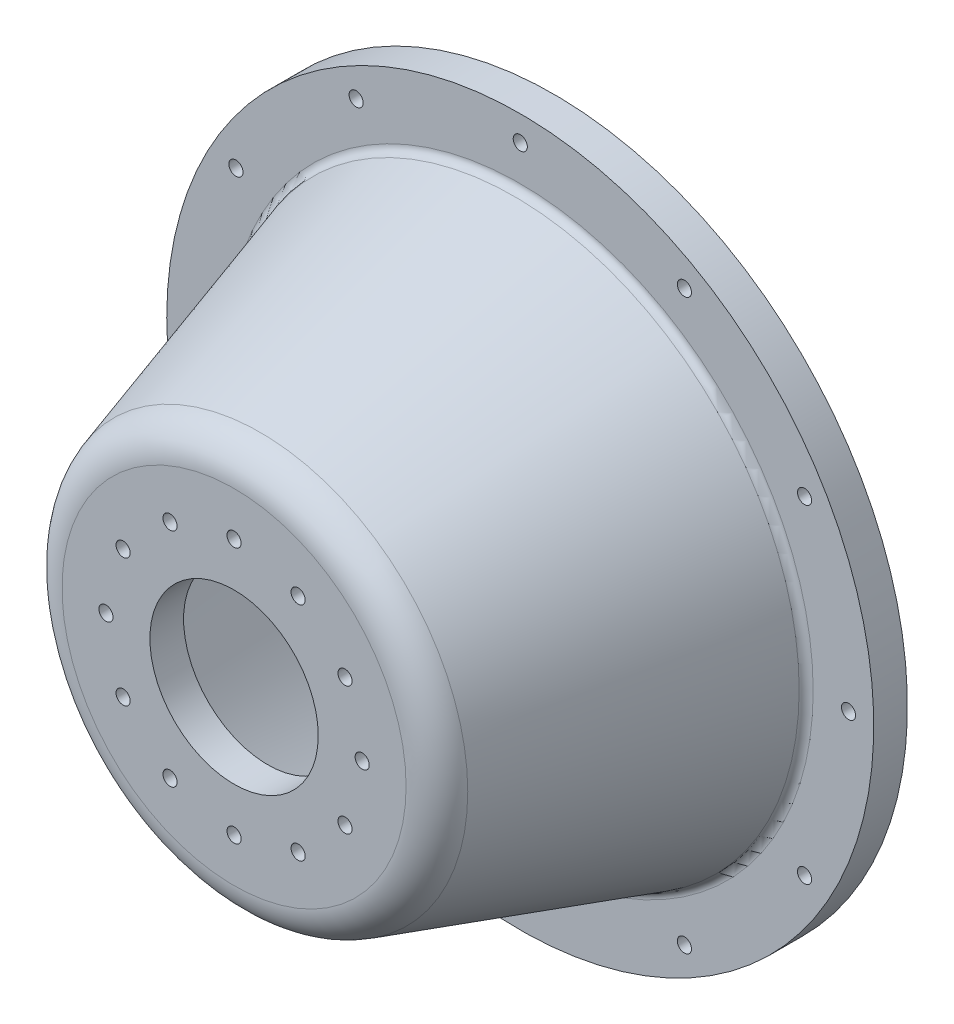
ISO-10303-21;
HEADER;
FILE_DESCRIPTION(('STEP AP214'),'2;1');
FILE_NAME('part.step','',(''),(''),'','','');
FILE_SCHEMA(('AUTOMOTIVE_DESIGN { 1 0 10303 214 1 1 1 1 }'));
ENDSEC;
DATA;
#1=APPLICATION_CONTEXT('core data for automotive mechanical design processes');
#2=APPLICATION_PROTOCOL_DEFINITION('international standard','automotive_design',2000,#1);
#3=PRODUCT_CONTEXT('',#1,'mechanical');
#4=PRODUCT('Part','Part','',(#3));
#5=PRODUCT_RELATED_PRODUCT_CATEGORY('part','',(#4));
#6=PRODUCT_DEFINITION_FORMATION('','',#4);
#7=PRODUCT_DEFINITION_CONTEXT('part definition',#1,'design');
#8=PRODUCT_DEFINITION('design','',#6,#7);
#9=PRODUCT_DEFINITION_SHAPE('','',#8);
#10=(LENGTH_UNIT() NAMED_UNIT(*) SI_UNIT(.MILLI.,.METRE.));
#11=(NAMED_UNIT(*) PLANE_ANGLE_UNIT() SI_UNIT($,.RADIAN.));
#12=(NAMED_UNIT(*) SI_UNIT($,.STERADIAN.) SOLID_ANGLE_UNIT());
#13=UNCERTAINTY_MEASURE_WITH_UNIT(LENGTH_MEASURE(1.E-05),#10,'distance_accuracy_value','');
#14=(GEOMETRIC_REPRESENTATION_CONTEXT(3) GLOBAL_UNCERTAINTY_ASSIGNED_CONTEXT((#13)) GLOBAL_UNIT_ASSIGNED_CONTEXT((#10,
#11,#12)) REPRESENTATION_CONTEXT('',''));
#15=CARTESIAN_POINT('',(0.,0.,0.));
#16=DIRECTION('',(0.,0.,1.));
#17=DIRECTION('',(1.,0.,0.));
#18=AXIS2_PLACEMENT_3D('',#15,#16,#17);
#19=CARTESIAN_POINT('',(50.,0.,170.));
#20=DIRECTION('',(0.,0.,1.));
#21=DIRECTION('',(1.,0.,0.));
#22=AXIS2_PLACEMENT_3D('',#19,#20,#21);
#23=PLANE('',#22);
#24=CARTESIAN_POINT('',(0.,0.,170.));
#25=DIRECTION('',(0.,0.,1.));
#26=DIRECTION('',(1.,0.,0.));
#27=AXIS2_PLACEMENT_3D('',#24,#25,#26);
#28=CIRCLE('',#27,102.190476190476);
#29=CARTESIAN_POINT('',(102.190476190476,0.,170.));
#30=VERTEX_POINT('',#29);
#31=EDGE_CURVE('E67',#30,#30,#28,.F.);
#32=ORIENTED_EDGE('',*,*,#31,.T.);
#33=EDGE_LOOP('',(#32));
#34=FACE_BOUND('',#33,.T.);
#35=CARTESIAN_POINT('',(0.,76.0952380952381,170.));
#36=DIRECTION('',(0.,0.,-1.));
#37=DIRECTION('',(-1.,0.,0.));
#38=AXIS2_PLACEMENT_3D('',#35,#36,#37);
#39=CIRCLE('',#38,4.19999999999999);
#40=CARTESIAN_POINT('',(-4.19999999999999,76.0952380952381,170.));
#41=VERTEX_POINT('',#40);
#42=EDGE_CURVE('E226',#41,#41,#39,.T.);
#43=ORIENTED_EDGE('',*,*,#42,.F.);
#44=EDGE_LOOP('',(#43));
#45=FACE_BOUND('',#44,.T.);
#46=CARTESIAN_POINT('',(-38.047619047619,65.9004092975016,170.));
#47=DIRECTION('',(0.,0.,-1.));
#48=DIRECTION('',(-1.,0.,0.));
#49=AXIS2_PLACEMENT_3D('',#46,#47,#48);
#50=CIRCLE('',#49,4.19999999999999);
#51=CARTESIAN_POINT('',(-42.247619047619,65.9004092975016,170.));
#52=VERTEX_POINT('',#51);
#53=EDGE_CURVE('E220',#52,#52,#50,.T.);
#54=ORIENTED_EDGE('',*,*,#53,.F.);
#55=EDGE_LOOP('',(#54));
#56=FACE_BOUND('',#55,.T.);
#57=CARTESIAN_POINT('',(-65.9004092975016,38.047619047619,170.));
#58=DIRECTION('',(0.,0.,-1.));
#59=DIRECTION('',(-1.,0.,0.));
#60=AXIS2_PLACEMENT_3D('',#57,#58,#59);
#61=CIRCLE('',#60,4.19999999999999);
#62=CARTESIAN_POINT('',(-70.1004092975016,38.047619047619,170.));
#63=VERTEX_POINT('',#62);
#64=EDGE_CURVE('E214',#63,#63,#61,.T.);
#65=ORIENTED_EDGE('',*,*,#64,.F.);
#66=EDGE_LOOP('',(#65));
#67=FACE_BOUND('',#66,.T.);
#68=CARTESIAN_POINT('',(-76.0952380952381,0.,170.));
#69=DIRECTION('',(0.,0.,-1.));
#70=DIRECTION('',(-1.,0.,0.));
#71=AXIS2_PLACEMENT_3D('',#68,#69,#70);
#72=CIRCLE('',#71,4.2);
#73=CARTESIAN_POINT('',(-80.2952380952381,0.,170.));
#74=VERTEX_POINT('',#73);
#75=EDGE_CURVE('E208',#74,#74,#72,.T.);
#76=ORIENTED_EDGE('',*,*,#75,.F.);
#77=EDGE_LOOP('',(#76));
#78=FACE_BOUND('',#77,.T.);
#79=CARTESIAN_POINT('',(-65.9004092975016,-38.047619047619,170.));
#80=DIRECTION('',(0.,0.,-1.));
#81=DIRECTION('',(-1.,0.,0.));
#82=AXIS2_PLACEMENT_3D('',#79,#80,#81);
#83=CIRCLE('',#82,4.19999999999999);
#84=CARTESIAN_POINT('',(-70.1004092975016,-38.047619047619,170.));
#85=VERTEX_POINT('',#84);
#86=EDGE_CURVE('E202',#85,#85,#83,.T.);
#87=ORIENTED_EDGE('',*,*,#86,.F.);
#88=EDGE_LOOP('',(#87));
#89=FACE_BOUND('',#88,.T.);
#90=CARTESIAN_POINT('',(-38.0476190476191,-65.9004092975016,170.));
#91=DIRECTION('',(0.,0.,-1.));
#92=DIRECTION('',(-1.,0.,0.));
#93=AXIS2_PLACEMENT_3D('',#90,#91,#92);
#94=CIRCLE('',#93,4.19999999999999);
#95=CARTESIAN_POINT('',(-42.2476190476191,-65.9004092975016,170.));
#96=VERTEX_POINT('',#95);
#97=EDGE_CURVE('E196',#96,#96,#94,.T.);
#98=ORIENTED_EDGE('',*,*,#97,.F.);
#99=EDGE_LOOP('',(#98));
#100=FACE_BOUND('',#99,.T.);
#101=CARTESIAN_POINT('',(0.,-76.0952380952381,170.));
#102=DIRECTION('',(0.,0.,-1.));
#103=DIRECTION('',(-1.,0.,0.));
#104=AXIS2_PLACEMENT_3D('',#101,#102,#103);
#105=CIRCLE('',#104,4.19999999999999);
#106=CARTESIAN_POINT('',(-4.20000000000005,-76.0952380952381,170.));
#107=VERTEX_POINT('',#106);
#108=EDGE_CURVE('E190',#107,#107,#105,.T.);
#109=ORIENTED_EDGE('',*,*,#108,.F.);
#110=EDGE_LOOP('',(#109));
#111=FACE_BOUND('',#110,.T.);
#112=CARTESIAN_POINT('',(38.047619047619,-65.9004092975016,170.));
#113=DIRECTION('',(0.,0.,-1.));
#114=DIRECTION('',(-1.,0.,0.));
#115=AXIS2_PLACEMENT_3D('',#112,#113,#114);
#116=CIRCLE('',#115,4.19999999999999);
#117=CARTESIAN_POINT('',(33.847619047619,-65.9004092975016,170.));
#118=VERTEX_POINT('',#117);
#119=EDGE_CURVE('E184',#118,#118,#116,.T.);
#120=ORIENTED_EDGE('',*,*,#119,.F.);
#121=EDGE_LOOP('',(#120));
#122=FACE_BOUND('',#121,.T.);
#123=CARTESIAN_POINT('',(65.9004092975015,-38.0476190476192,170.));
#124=DIRECTION('',(0.,0.,-1.));
#125=DIRECTION('',(-1.,0.,0.));
#126=AXIS2_PLACEMENT_3D('',#123,#124,#125);
#127=CIRCLE('',#126,4.2);
#128=CARTESIAN_POINT('',(61.7004092975015,-38.0476190476192,170.));
#129=VERTEX_POINT('',#128);
#130=EDGE_CURVE('E178',#129,#129,#127,.T.);
#131=ORIENTED_EDGE('',*,*,#130,.F.);
#132=EDGE_LOOP('',(#131));
#133=FACE_BOUND('',#132,.T.);
#134=CARTESIAN_POINT('',(76.0952380952381,0.,170.));
#135=DIRECTION('',(0.,0.,-1.));
#136=DIRECTION('',(-1.,0.,0.));
#137=AXIS2_PLACEMENT_3D('',#134,#135,#136);
#138=CIRCLE('',#137,4.2);
#139=CARTESIAN_POINT('',(71.8952380952381,0.,170.));
#140=VERTEX_POINT('',#139);
#141=EDGE_CURVE('E172',#140,#140,#138,.T.);
#142=ORIENTED_EDGE('',*,*,#141,.F.);
#143=EDGE_LOOP('',(#142));
#144=FACE_BOUND('',#143,.T.);
#145=CARTESIAN_POINT('',(65.9004092975016,38.047619047619,170.));
#146=DIRECTION('',(0.,0.,-1.));
#147=DIRECTION('',(-1.,0.,0.));
#148=AXIS2_PLACEMENT_3D('',#145,#146,#147);
#149=CIRCLE('',#148,4.19999999999998);
#150=CARTESIAN_POINT('',(61.7004092975016,38.047619047619,170.));
#151=VERTEX_POINT('',#150);
#152=EDGE_CURVE('E166',#151,#151,#149,.T.);
#153=ORIENTED_EDGE('',*,*,#152,.F.);
#154=EDGE_LOOP('',(#153));
#155=FACE_BOUND('',#154,.T.);
#156=CARTESIAN_POINT('',(0.,0.,170.));
#157=DIRECTION('',(0.,0.,1.));
#158=DIRECTION('',(1.,0.,0.));
#159=AXIS2_PLACEMENT_3D('',#156,#157,#158);
#160=CIRCLE('',#159,50.);
#161=CARTESIAN_POINT('',(50.,0.,170.));
#162=VERTEX_POINT('',#161);
#163=EDGE_CURVE('E82',#162,#162,#160,.T.);
#164=ORIENTED_EDGE('',*,*,#163,.T.);
#165=EDGE_LOOP('',(#164));
#166=FACE_BOUND('',#165,.T.);
#167=CARTESIAN_POINT('',(38.0476190476192,65.9004092975015,170.));
#168=DIRECTION('',(0.,0.,-1.));
#169=DIRECTION('',(-1.,0.,0.));
#170=AXIS2_PLACEMENT_3D('',#167,#168,#169);
#171=CIRCLE('',#170,4.19999999999999);
#172=CARTESIAN_POINT('',(33.8476190476192,65.9004092975015,170.));
#173=VERTEX_POINT('',#172);
#174=EDGE_CURVE('E160',#173,#173,#171,.T.);
#175=ORIENTED_EDGE('',*,*,#174,.F.);
#176=EDGE_LOOP('',(#175));
#177=FACE_BOUND('',#176,.T.);
#178=ADVANCED_FACE('F41',(#34,#45,#56,#67,#78,#89,#100,#111,#122,#133,#144,#155,#166,#177),#23,.F.);
#179=CARTESIAN_POINT('',(0.,0.,20.));
#180=DIRECTION('',(0.,0.,-1.));
#181=DIRECTION('',(-1.,0.,0.));
#182=AXIS2_PLACEMENT_3D('',#179,#180,#181);
#183=CYLINDRICAL_SURFACE('',#182,210.);
#184=CARTESIAN_POINT('',(0.,0.,20.));
#185=DIRECTION('',(0.,0.,-1.));
#186=DIRECTION('',(-1.,0.,0.));
#187=AXIS2_PLACEMENT_3D('',#184,#185,#186);
#188=CIRCLE('',#187,210.);
#189=CARTESIAN_POINT('',(-210.,0.,20.));
#190=VERTEX_POINT('',#189);
#191=EDGE_CURVE('E73',#190,#190,#188,.T.);
#192=ORIENTED_EDGE('',*,*,#191,.T.);
#193=EDGE_LOOP('',(#192));
#194=FACE_BOUND('',#193,.T.);
#195=CARTESIAN_POINT('',(0.,0.,0.));
#196=DIRECTION('',(0.,0.,-1.));
#197=DIRECTION('',(-1.,0.,0.));
#198=AXIS2_PLACEMENT_3D('',#195,#196,#197);
#199=CIRCLE('',#198,210.);
#200=CARTESIAN_POINT('',(-210.,0.,0.));
#201=VERTEX_POINT('',#200);
#202=EDGE_CURVE('E76',#201,#201,#199,.T.);
#203=ORIENTED_EDGE('',*,*,#202,.F.);
#204=EDGE_LOOP('',(#203));
#205=FACE_BOUND('',#204,.T.);
#206=ADVANCED_FACE('F234',(#194,#205),#183,.T.);
#207=CARTESIAN_POINT('',(210.,0.,20.));
#208=DIRECTION('',(0.,0.,1.));
#209=DIRECTION('',(1.,0.,0.));
#210=AXIS2_PLACEMENT_3D('',#207,#208,#209);
#211=PLANE('',#210);
#212=CARTESIAN_POINT('',(0.,0.,20.));
#213=DIRECTION('',(0.,0.,1.));
#214=DIRECTION('',(1.,0.,0.));
#215=AXIS2_PLACEMENT_3D('',#212,#213,#214);
#216=CIRCLE('',#215,174.);
#217=CARTESIAN_POINT('',(174.,0.,20.));
#218=VERTEX_POINT('',#217);
#219=EDGE_CURVE('E61',#218,#218,#216,.F.);
#220=ORIENTED_EDGE('',*,*,#219,.T.);
#221=EDGE_LOOP('',(#220));
#222=FACE_BOUND('',#221,.T.);
#223=CARTESIAN_POINT('',(0.,195.,20.));
#224=DIRECTION('',(0.,0.,1.));
#225=DIRECTION('',(1.,0.,0.));
#226=AXIS2_PLACEMENT_3D('',#223,#224,#225);
#227=CIRCLE('',#226,4.19999999999999);
#228=CARTESIAN_POINT('',(4.19999999999999,195.,20.));
#229=VERTEX_POINT('',#228);
#230=EDGE_CURVE('E154',#229,#229,#227,.T.);
#231=ORIENTED_EDGE('',*,*,#230,.F.);
#232=EDGE_LOOP('',(#231));
#233=FACE_BOUND('',#232,.T.);
#234=CARTESIAN_POINT('',(97.5,168.874953737965,20.));
#235=DIRECTION('',(0.,0.,1.));
#236=DIRECTION('',(1.,0.,0.));
#237=AXIS2_PLACEMENT_3D('',#234,#235,#236);
#238=CIRCLE('',#237,4.19999999999998);
#239=CARTESIAN_POINT('',(101.7,168.874953737965,20.));
#240=VERTEX_POINT('',#239);
#241=EDGE_CURVE('E148',#240,#240,#238,.T.);
#242=ORIENTED_EDGE('',*,*,#241,.F.);
#243=EDGE_LOOP('',(#242));
#244=FACE_BOUND('',#243,.T.);
#245=CARTESIAN_POINT('',(168.874953737965,97.5,20.));
#246=DIRECTION('',(0.,0.,1.));
#247=DIRECTION('',(1.,0.,0.));
#248=AXIS2_PLACEMENT_3D('',#245,#246,#247);
#249=CIRCLE('',#248,4.19999999999998);
#250=CARTESIAN_POINT('',(173.074953737965,97.5,20.));
#251=VERTEX_POINT('',#250);
#252=EDGE_CURVE('E142',#251,#251,#249,.T.);
#253=ORIENTED_EDGE('',*,*,#252,.F.);
#254=EDGE_LOOP('',(#253));
#255=FACE_BOUND('',#254,.T.);
#256=CARTESIAN_POINT('',(195.,0.,20.));
#257=DIRECTION('',(0.,0.,1.));
#258=DIRECTION('',(1.,0.,0.));
#259=AXIS2_PLACEMENT_3D('',#256,#257,#258);
#260=CIRCLE('',#259,4.19999999999998);
#261=CARTESIAN_POINT('',(199.2,0.,20.));
#262=VERTEX_POINT('',#261);
#263=EDGE_CURVE('E136',#262,#262,#260,.T.);
#264=ORIENTED_EDGE('',*,*,#263,.F.);
#265=EDGE_LOOP('',(#264));
#266=FACE_BOUND('',#265,.T.);
#267=CARTESIAN_POINT('',(168.874953737965,-97.5,20.));
#268=DIRECTION('',(0.,0.,1.));
#269=DIRECTION('',(1.,0.,0.));
#270=AXIS2_PLACEMENT_3D('',#267,#268,#269);
#271=CIRCLE('',#270,4.19999999999998);
#272=CARTESIAN_POINT('',(173.074953737965,-97.5,20.));
#273=VERTEX_POINT('',#272);
#274=EDGE_CURVE('E130',#273,#273,#271,.T.);
#275=ORIENTED_EDGE('',*,*,#274,.F.);
#276=EDGE_LOOP('',(#275));
#277=FACE_BOUND('',#276,.T.);
#278=CARTESIAN_POINT('',(97.5,-168.874953737965,20.));
#279=DIRECTION('',(0.,0.,1.));
#280=DIRECTION('',(1.,0.,0.));
#281=AXIS2_PLACEMENT_3D('',#278,#279,#280);
#282=CIRCLE('',#281,4.19999999999998);
#283=CARTESIAN_POINT('',(101.7,-168.874953737965,20.));
#284=VERTEX_POINT('',#283);
#285=EDGE_CURVE('E124',#284,#284,#282,.T.);
#286=ORIENTED_EDGE('',*,*,#285,.F.);
#287=EDGE_LOOP('',(#286));
#288=FACE_BOUND('',#287,.T.);
#289=CARTESIAN_POINT('',(1.49314179258151E-13,-195.,20.));
#290=DIRECTION('',(0.,0.,1.));
#291=DIRECTION('',(1.,0.,0.));
#292=AXIS2_PLACEMENT_3D('',#289,#290,#291);
#293=CIRCLE('',#292,4.19999999999999);
#294=CARTESIAN_POINT('',(4.20000000000014,-195.,20.));
#295=VERTEX_POINT('',#294);
#296=EDGE_CURVE('E118',#295,#295,#293,.T.);
#297=ORIENTED_EDGE('',*,*,#296,.F.);
#298=EDGE_LOOP('',(#297));
#299=FACE_BOUND('',#298,.T.);
#300=CARTESIAN_POINT('',(-97.5,-168.874953737965,20.));
#301=DIRECTION('',(0.,0.,1.));
#302=DIRECTION('',(1.,0.,0.));
#303=AXIS2_PLACEMENT_3D('',#300,#301,#302);
#304=CIRCLE('',#303,4.19999999999998);
#305=CARTESIAN_POINT('',(-93.3,-168.874953737965,20.));
#306=VERTEX_POINT('',#305);
#307=EDGE_CURVE('E112',#306,#306,#304,.T.);
#308=ORIENTED_EDGE('',*,*,#307,.F.);
#309=EDGE_LOOP('',(#308));
#310=FACE_BOUND('',#309,.T.);
#311=CARTESIAN_POINT('',(-168.874953737965,-97.5,20.));
#312=DIRECTION('',(0.,0.,1.));
#313=DIRECTION('',(1.,0.,0.));
#314=AXIS2_PLACEMENT_3D('',#311,#312,#313);
#315=CIRCLE('',#314,4.19999999999998);
#316=CARTESIAN_POINT('',(-164.674953737965,-97.5,20.));
#317=VERTEX_POINT('',#316);
#318=EDGE_CURVE('E106',#317,#317,#315,.T.);
#319=ORIENTED_EDGE('',*,*,#318,.F.);
#320=EDGE_LOOP('',(#319));
#321=FACE_BOUND('',#320,.T.);
#322=CARTESIAN_POINT('',(-195.,-2.04553183510219E-13,20.));
#323=DIRECTION('',(0.,0.,1.));
#324=DIRECTION('',(1.,0.,0.));
#325=AXIS2_PLACEMENT_3D('',#322,#323,#324);
#326=CIRCLE('',#325,4.19999999999998);
#327=CARTESIAN_POINT('',(-190.8,-2.04553183510219E-13,20.));
#328=VERTEX_POINT('',#327);
#329=EDGE_CURVE('E100',#328,#328,#326,.T.);
#330=ORIENTED_EDGE('',*,*,#329,.F.);
#331=EDGE_LOOP('',(#330));
#332=FACE_BOUND('',#331,.T.);
#333=CARTESIAN_POINT('',(-168.874953737965,97.5,20.));
#334=DIRECTION('',(0.,0.,1.));
#335=DIRECTION('',(1.,0.,0.));
#336=AXIS2_PLACEMENT_3D('',#333,#334,#335);
#337=CIRCLE('',#336,4.19999999999998);
#338=CARTESIAN_POINT('',(-164.674953737965,97.5,20.));
#339=VERTEX_POINT('',#338);
#340=EDGE_CURVE('E94',#339,#339,#337,.T.);
#341=ORIENTED_EDGE('',*,*,#340,.F.);
#342=EDGE_LOOP('',(#341));
#343=FACE_BOUND('',#342,.T.);
#344=CARTESIAN_POINT('',(-97.5,168.874953737965,20.));
#345=DIRECTION('',(0.,0.,1.));
#346=DIRECTION('',(1.,0.,0.));
#347=AXIS2_PLACEMENT_3D('',#344,#345,#346);
#348=CIRCLE('',#347,4.19999999999998);
#349=CARTESIAN_POINT('',(-93.3,168.874953737965,20.));
#350=VERTEX_POINT('',#349);
#351=EDGE_CURVE('E88',#350,#350,#348,.T.);
#352=ORIENTED_EDGE('',*,*,#351,.F.);
#353=EDGE_LOOP('',(#352));
#354=FACE_BOUND('',#353,.T.);
#355=ORIENTED_EDGE('',*,*,#191,.F.);
#356=EDGE_LOOP('',(#355));
#357=FACE_BOUND('',#356,.T.);
#358=ADVANCED_FACE('F341',(#222,#233,#244,#255,#266,#277,#288,#299,#310,#321,#332,#343,#354,
#357),#211,.T.);
#359=CARTESIAN_POINT('',(0.,0.,0.));
#360=DIRECTION('',(0.,0.,-1.));
#361=DIRECTION('',(-1.,0.,0.));
#362=AXIS2_PLACEMENT_3D('',#359,#360,#361);
#363=PLANE('',#362);
#364=CARTESIAN_POINT('',(0.,0.,0.));
#365=DIRECTION('',(0.,0.,-1.));
#366=DIRECTION('',(-1.,0.,0.));
#367=AXIS2_PLACEMENT_3D('',#364,#365,#366);
#368=CIRCLE('',#367,174.);
#369=CARTESIAN_POINT('',(-174.,0.,0.));
#370=VERTEX_POINT('',#369);
#371=EDGE_CURVE('E48',#370,#370,#368,.F.);
#372=ORIENTED_EDGE('',*,*,#371,.T.);
#373=EDGE_LOOP('',(#372));
#374=FACE_BOUND('',#373,.T.);
#375=CARTESIAN_POINT('',(0.,195.,0.));
#376=DIRECTION('',(0.,0.,1.));
#377=DIRECTION('',(1.,0.,0.));
#378=AXIS2_PLACEMENT_3D('',#375,#376,#377);
#379=CIRCLE('',#378,4.19999999999999);
#380=CARTESIAN_POINT('',(4.19999999999999,195.,0.));
#381=VERTEX_POINT('',#380);
#382=EDGE_CURVE('E151',#381,#381,#379,.T.);
#383=ORIENTED_EDGE('',*,*,#382,.T.);
#384=EDGE_LOOP('',(#383));
#385=FACE_BOUND('',#384,.T.);
#386=CARTESIAN_POINT('',(97.5,168.874953737965,0.));
#387=DIRECTION('',(0.,0.,1.));
#388=DIRECTION('',(1.,0.,0.));
#389=AXIS2_PLACEMENT_3D('',#386,#387,#388);
#390=CIRCLE('',#389,4.19999999999998);
#391=CARTESIAN_POINT('',(101.7,168.874953737965,0.));
#392=VERTEX_POINT('',#391);
#393=EDGE_CURVE('E145',#392,#392,#390,.T.);
#394=ORIENTED_EDGE('',*,*,#393,.T.);
#395=EDGE_LOOP('',(#394));
#396=FACE_BOUND('',#395,.T.);
#397=CARTESIAN_POINT('',(168.874953737965,97.5,0.));
#398=DIRECTION('',(0.,0.,1.));
#399=DIRECTION('',(1.,0.,0.));
#400=AXIS2_PLACEMENT_3D('',#397,#398,#399);
#401=CIRCLE('',#400,4.19999999999998);
#402=CARTESIAN_POINT('',(173.074953737965,97.5,0.));
#403=VERTEX_POINT('',#402);
#404=EDGE_CURVE('E139',#403,#403,#401,.T.);
#405=ORIENTED_EDGE('',*,*,#404,.T.);
#406=EDGE_LOOP('',(#405));
#407=FACE_BOUND('',#406,.T.);
#408=CARTESIAN_POINT('',(195.,0.,0.));
#409=DIRECTION('',(0.,0.,1.));
#410=DIRECTION('',(1.,0.,0.));
#411=AXIS2_PLACEMENT_3D('',#408,#409,#410);
#412=CIRCLE('',#411,4.19999999999998);
#413=CARTESIAN_POINT('',(199.2,0.,0.));
#414=VERTEX_POINT('',#413);
#415=EDGE_CURVE('E133',#414,#414,#412,.T.);
#416=ORIENTED_EDGE('',*,*,#415,.T.);
#417=EDGE_LOOP('',(#416));
#418=FACE_BOUND('',#417,.T.);
#419=CARTESIAN_POINT('',(168.874953737965,-97.5,0.));
#420=DIRECTION('',(0.,0.,1.));
#421=DIRECTION('',(1.,0.,0.));
#422=AXIS2_PLACEMENT_3D('',#419,#420,#421);
#423=CIRCLE('',#422,4.19999999999998);
#424=CARTESIAN_POINT('',(173.074953737965,-97.5,0.));
#425=VERTEX_POINT('',#424);
#426=EDGE_CURVE('E127',#425,#425,#423,.T.);
#427=ORIENTED_EDGE('',*,*,#426,.T.);
#428=EDGE_LOOP('',(#427));
#429=FACE_BOUND('',#428,.T.);
#430=CARTESIAN_POINT('',(97.5,-168.874953737965,0.));
#431=DIRECTION('',(0.,0.,1.));
#432=DIRECTION('',(1.,0.,0.));
#433=AXIS2_PLACEMENT_3D('',#430,#431,#432);
#434=CIRCLE('',#433,4.19999999999998);
#435=CARTESIAN_POINT('',(101.7,-168.874953737965,0.));
#436=VERTEX_POINT('',#435);
#437=EDGE_CURVE('E121',#436,#436,#434,.T.);
#438=ORIENTED_EDGE('',*,*,#437,.T.);
#439=EDGE_LOOP('',(#438));
#440=FACE_BOUND('',#439,.T.);
#441=CARTESIAN_POINT('',(1.49314179258151E-13,-195.,0.));
#442=DIRECTION('',(0.,0.,1.));
#443=DIRECTION('',(1.,0.,0.));
#444=AXIS2_PLACEMENT_3D('',#441,#442,#443);
#445=CIRCLE('',#444,4.19999999999999);
#446=CARTESIAN_POINT('',(4.20000000000014,-195.,0.));
#447=VERTEX_POINT('',#446);
#448=EDGE_CURVE('E115',#447,#447,#445,.T.);
#449=ORIENTED_EDGE('',*,*,#448,.T.);
#450=EDGE_LOOP('',(#449));
#451=FACE_BOUND('',#450,.T.);
#452=CARTESIAN_POINT('',(-97.5,-168.874953737965,0.));
#453=DIRECTION('',(0.,0.,1.));
#454=DIRECTION('',(1.,0.,0.));
#455=AXIS2_PLACEMENT_3D('',#452,#453,#454);
#456=CIRCLE('',#455,4.19999999999998);
#457=CARTESIAN_POINT('',(-93.3,-168.874953737965,0.));
#458=VERTEX_POINT('',#457);
#459=EDGE_CURVE('E109',#458,#458,#456,.T.);
#460=ORIENTED_EDGE('',*,*,#459,.T.);
#461=EDGE_LOOP('',(#460));
#462=FACE_BOUND('',#461,.T.);
#463=CARTESIAN_POINT('',(-168.874953737965,-97.5,0.));
#464=DIRECTION('',(0.,0.,1.));
#465=DIRECTION('',(1.,0.,0.));
#466=AXIS2_PLACEMENT_3D('',#463,#464,#465);
#467=CIRCLE('',#466,4.19999999999998);
#468=CARTESIAN_POINT('',(-164.674953737965,-97.5,0.));
#469=VERTEX_POINT('',#468);
#470=EDGE_CURVE('E103',#469,#469,#467,.T.);
#471=ORIENTED_EDGE('',*,*,#470,.T.);
#472=EDGE_LOOP('',(#471));
#473=FACE_BOUND('',#472,.T.);
#474=CARTESIAN_POINT('',(-195.,-2.04553183510219E-13,0.));
#475=DIRECTION('',(0.,0.,1.));
#476=DIRECTION('',(1.,0.,0.));
#477=AXIS2_PLACEMENT_3D('',#474,#475,#476);
#478=CIRCLE('',#477,4.19999999999998);
#479=CARTESIAN_POINT('',(-190.8,-2.04553183510219E-13,0.));
#480=VERTEX_POINT('',#479);
#481=EDGE_CURVE('E97',#480,#480,#478,.T.);
#482=ORIENTED_EDGE('',*,*,#481,.T.);
#483=EDGE_LOOP('',(#482));
#484=FACE_BOUND('',#483,.T.);
#485=CARTESIAN_POINT('',(-168.874953737965,97.5,0.));
#486=DIRECTION('',(0.,0.,1.));
#487=DIRECTION('',(1.,0.,0.));
#488=AXIS2_PLACEMENT_3D('',#485,#486,#487);
#489=CIRCLE('',#488,4.19999999999998);
#490=CARTESIAN_POINT('',(-164.674953737965,97.5,0.));
#491=VERTEX_POINT('',#490);
#492=EDGE_CURVE('E91',#491,#491,#489,.T.);
#493=ORIENTED_EDGE('',*,*,#492,.T.);
#494=EDGE_LOOP('',(#493));
#495=FACE_BOUND('',#494,.T.);
#496=CARTESIAN_POINT('',(-97.5,168.874953737965,0.));
#497=DIRECTION('',(0.,0.,1.));
#498=DIRECTION('',(1.,0.,0.));
#499=AXIS2_PLACEMENT_3D('',#496,#497,#498);
#500=CIRCLE('',#499,4.19999999999998);
#501=CARTESIAN_POINT('',(-93.3,168.874953737965,0.));
#502=VERTEX_POINT('',#501);
#503=EDGE_CURVE('E85',#502,#502,#500,.T.);
#504=ORIENTED_EDGE('',*,*,#503,.T.);
#505=EDGE_LOOP('',(#504));
#506=FACE_BOUND('',#505,.T.);
#507=ORIENTED_EDGE('',*,*,#202,.T.);
#508=EDGE_LOOP('',(#507));
#509=FACE_BOUND('',#508,.T.);
#510=ADVANCED_FACE('F337',(#374,#385,#396,#407,#418,#429,#440,#451,#462,#473,#484,#495,#506,
#509),#363,.T.);
#511=CARTESIAN_POINT('',(0.,0.,20.));
#512=DIRECTION('',(0.,0.,-1.));
#513=DIRECTION('',(1.,0.,0.));
#514=AXIS2_PLACEMENT_3D('',#511,#512,#513);
#515=CONICAL_SURFACE('',#514,170.296824316959,0.295835115462155);
#516=CARTESIAN_POINT('',(0.,0.,174.41385335603));
#517=DIRECTION('',(0.,0.,-1.));
#518=DIRECTION('',(-1.,0.,0.));
#519=AXIS2_PLACEMENT_3D('',#516,#517,#518);
#520=CIRCLE('',#519,123.234774352386);
#521=CARTESIAN_POINT('',(-123.234774352386,0.,174.41385335603));
#522=VERTEX_POINT('',#521);
#523=EDGE_CURVE('E52',#522,#522,#520,.T.);
#524=ORIENTED_EDGE('',*,*,#523,.T.);
#525=EDGE_LOOP('',(#524));
#526=FACE_BOUND('',#525,.T.);
#527=CARTESIAN_POINT('',(0.,0.,23.5423060554477));
#528=DIRECTION('',(0.,0.,1.));
#529=DIRECTION('',(1.,0.,0.));
#530=AXIS2_PLACEMENT_3D('',#527,#528,#529);
#531=CIRCLE('',#530,169.217204963202);
#532=CARTESIAN_POINT('',(169.217204963202,0.,23.5423060554477));
#533=VERTEX_POINT('',#532);
#534=EDGE_CURVE('E64',#533,#533,#531,.T.);
#535=ORIENTED_EDGE('',*,*,#534,.T.);
#536=EDGE_LOOP('',(#535));
#537=FACE_BOUND('',#536,.T.);
#538=ADVANCED_FACE('F333',(#526,#537),#515,.T.);
#539=CARTESIAN_POINT('',(0.,0.,190.));
#540=DIRECTION('',(0.,0.,1.));
#541=DIRECTION('',(1.,0.,0.));
#542=AXIS2_PLACEMENT_3D('',#539,#540,#541);
#543=PLANE('',#542);
#544=CARTESIAN_POINT('',(0.,0.,190.));
#545=DIRECTION('',(0.,0.,1.));
#546=DIRECTION('',(1.,0.,0.));
#547=AXIS2_PLACEMENT_3D('',#544,#545,#546);
#548=CIRCLE('',#547,102.190476190477);
#549=CARTESIAN_POINT('',(102.190476190477,0.,190.));
#550=VERTEX_POINT('',#549);
#551=EDGE_CURVE('E56',#550,#550,#548,.T.);
#552=ORIENTED_EDGE('',*,*,#551,.T.);
#553=EDGE_LOOP('',(#552));
#554=FACE_BOUND('',#553,.T.);
#555=CARTESIAN_POINT('',(0.,76.0952380952381,190.));
#556=DIRECTION('',(0.,0.,-1.));
#557=DIRECTION('',(-1.,0.,0.));
#558=AXIS2_PLACEMENT_3D('',#555,#556,#557);
#559=CIRCLE('',#558,4.19999999999999);
#560=CARTESIAN_POINT('',(-4.19999999999999,76.0952380952381,190.));
#561=VERTEX_POINT('',#560);
#562=EDGE_CURVE('E223',#561,#561,#559,.T.);
#563=ORIENTED_EDGE('',*,*,#562,.T.);
#564=EDGE_LOOP('',(#563));
#565=FACE_BOUND('',#564,.T.);
#566=CARTESIAN_POINT('',(-38.047619047619,65.9004092975016,190.));
#567=DIRECTION('',(0.,0.,-1.));
#568=DIRECTION('',(-1.,0.,0.));
#569=AXIS2_PLACEMENT_3D('',#566,#567,#568);
#570=CIRCLE('',#569,4.19999999999999);
#571=CARTESIAN_POINT('',(-42.247619047619,65.9004092975016,190.));
#572=VERTEX_POINT('',#571);
#573=EDGE_CURVE('E217',#572,#572,#570,.T.);
#574=ORIENTED_EDGE('',*,*,#573,.T.);
#575=EDGE_LOOP('',(#574));
#576=FACE_BOUND('',#575,.T.);
#577=CARTESIAN_POINT('',(-65.9004092975016,38.047619047619,190.));
#578=DIRECTION('',(0.,0.,-1.));
#579=DIRECTION('',(-1.,0.,0.));
#580=AXIS2_PLACEMENT_3D('',#577,#578,#579);
#581=CIRCLE('',#580,4.19999999999999);
#582=CARTESIAN_POINT('',(-70.1004092975016,38.047619047619,190.));
#583=VERTEX_POINT('',#582);
#584=EDGE_CURVE('E211',#583,#583,#581,.T.);
#585=ORIENTED_EDGE('',*,*,#584,.T.);
#586=EDGE_LOOP('',(#585));
#587=FACE_BOUND('',#586,.T.);
#588=CARTESIAN_POINT('',(-76.0952380952381,0.,190.));
#589=DIRECTION('',(0.,0.,-1.));
#590=DIRECTION('',(-1.,0.,0.));
#591=AXIS2_PLACEMENT_3D('',#588,#589,#590);
#592=CIRCLE('',#591,4.19999999999998);
#593=CARTESIAN_POINT('',(-80.2952380952381,0.,190.));
#594=VERTEX_POINT('',#593);
#595=EDGE_CURVE('E205',#594,#594,#592,.T.);
#596=ORIENTED_EDGE('',*,*,#595,.T.);
#597=EDGE_LOOP('',(#596));
#598=FACE_BOUND('',#597,.T.);
#599=CARTESIAN_POINT('',(-65.9004092975016,-38.047619047619,190.));
#600=DIRECTION('',(0.,0.,-1.));
#601=DIRECTION('',(-1.,0.,0.));
#602=AXIS2_PLACEMENT_3D('',#599,#600,#601);
#603=CIRCLE('',#602,4.19999999999999);
#604=CARTESIAN_POINT('',(-70.1004092975016,-38.047619047619,190.));
#605=VERTEX_POINT('',#604);
#606=EDGE_CURVE('E199',#605,#605,#603,.T.);
#607=ORIENTED_EDGE('',*,*,#606,.T.);
#608=EDGE_LOOP('',(#607));
#609=FACE_BOUND('',#608,.T.);
#610=CARTESIAN_POINT('',(-38.0476190476191,-65.9004092975016,190.));
#611=DIRECTION('',(0.,0.,-1.));
#612=DIRECTION('',(-1.,0.,0.));
#613=AXIS2_PLACEMENT_3D('',#610,#611,#612);
#614=CIRCLE('',#613,4.19999999999999);
#615=CARTESIAN_POINT('',(-42.2476190476191,-65.9004092975016,190.));
#616=VERTEX_POINT('',#615);
#617=EDGE_CURVE('E193',#616,#616,#614,.T.);
#618=ORIENTED_EDGE('',*,*,#617,.T.);
#619=EDGE_LOOP('',(#618));
#620=FACE_BOUND('',#619,.T.);
#621=CARTESIAN_POINT('',(0.,-76.0952380952381,190.));
#622=DIRECTION('',(0.,0.,-1.));
#623=DIRECTION('',(-1.,0.,0.));
#624=AXIS2_PLACEMENT_3D('',#621,#622,#623);
#625=CIRCLE('',#624,4.19999999999999);
#626=CARTESIAN_POINT('',(-4.20000000000004,-76.0952380952381,190.));
#627=VERTEX_POINT('',#626);
#628=EDGE_CURVE('E187',#627,#627,#625,.T.);
#629=ORIENTED_EDGE('',*,*,#628,.T.);
#630=EDGE_LOOP('',(#629));
#631=FACE_BOUND('',#630,.T.);
#632=CARTESIAN_POINT('',(38.047619047619,-65.9004092975016,190.));
#633=DIRECTION('',(0.,0.,-1.));
#634=DIRECTION('',(-1.,0.,0.));
#635=AXIS2_PLACEMENT_3D('',#632,#633,#634);
#636=CIRCLE('',#635,4.19999999999999);
#637=CARTESIAN_POINT('',(33.847619047619,-65.9004092975016,190.));
#638=VERTEX_POINT('',#637);
#639=EDGE_CURVE('E181',#638,#638,#636,.T.);
#640=ORIENTED_EDGE('',*,*,#639,.T.);
#641=EDGE_LOOP('',(#640));
#642=FACE_BOUND('',#641,.T.);
#643=CARTESIAN_POINT('',(65.9004092975015,-38.0476190476192,190.));
#644=DIRECTION('',(0.,0.,-1.));
#645=DIRECTION('',(-1.,0.,0.));
#646=AXIS2_PLACEMENT_3D('',#643,#644,#645);
#647=CIRCLE('',#646,4.19999999999998);
#648=CARTESIAN_POINT('',(61.7004092975015,-38.0476190476192,190.));
#649=VERTEX_POINT('',#648);
#650=EDGE_CURVE('E175',#649,#649,#647,.T.);
#651=ORIENTED_EDGE('',*,*,#650,.T.);
#652=EDGE_LOOP('',(#651));
#653=FACE_BOUND('',#652,.T.);
#654=CARTESIAN_POINT('',(76.0952380952381,0.,190.));
#655=DIRECTION('',(0.,0.,-1.));
#656=DIRECTION('',(-1.,0.,0.));
#657=AXIS2_PLACEMENT_3D('',#654,#655,#656);
#658=CIRCLE('',#657,4.19999999999998);
#659=CARTESIAN_POINT('',(71.8952380952381,0.,190.));
#660=VERTEX_POINT('',#659);
#661=EDGE_CURVE('E169',#660,#660,#658,.T.);
#662=ORIENTED_EDGE('',*,*,#661,.T.);
#663=EDGE_LOOP('',(#662));
#664=FACE_BOUND('',#663,.T.);
#665=CARTESIAN_POINT('',(65.9004092975016,38.047619047619,190.));
#666=DIRECTION('',(0.,0.,-1.));
#667=DIRECTION('',(-1.,0.,0.));
#668=AXIS2_PLACEMENT_3D('',#665,#666,#667);
#669=CIRCLE('',#668,4.19999999999998);
#670=CARTESIAN_POINT('',(61.7004092975016,38.047619047619,190.));
#671=VERTEX_POINT('',#670);
#672=EDGE_CURVE('E163',#671,#671,#669,.T.);
#673=ORIENTED_EDGE('',*,*,#672,.T.);
#674=EDGE_LOOP('',(#673));
#675=FACE_BOUND('',#674,.T.);
#676=CARTESIAN_POINT('',(38.0476190476192,65.9004092975015,190.));
#677=DIRECTION('',(0.,0.,-1.));
#678=DIRECTION('',(-1.,0.,0.));
#679=AXIS2_PLACEMENT_3D('',#676,#677,#678);
#680=CIRCLE('',#679,4.19999999999999);
#681=CARTESIAN_POINT('',(33.8476190476192,65.9004092975015,190.));
#682=VERTEX_POINT('',#681);
#683=EDGE_CURVE('E157',#682,#682,#680,.T.);
#684=ORIENTED_EDGE('',*,*,#683,.T.);
#685=EDGE_LOOP('',(#684));
#686=FACE_BOUND('',#685,.T.);
#687=CARTESIAN_POINT('',(0.,0.,190.));
#688=DIRECTION('',(0.,0.,1.));
#689=DIRECTION('',(1.,0.,0.));
#690=AXIS2_PLACEMENT_3D('',#687,#688,#689);
#691=CIRCLE('',#690,50.);
#692=CARTESIAN_POINT('',(50.,0.,190.));
#693=VERTEX_POINT('',#692);
#694=EDGE_CURVE('E79',#693,#693,#691,.T.);
#695=ORIENTED_EDGE('',*,*,#694,.F.);
#696=EDGE_LOOP('',(#695));
#697=FACE_BOUND('',#696,.T.);
#698=ADVANCED_FACE('F330',(#554,#565,#576,#587,#598,#609,#620,#631,#642,#653,#664,#675,#686,
#697),#543,.T.);
#699=CARTESIAN_POINT('',(0.,0.,170.));
#700=DIRECTION('',(0.,0.,-1.));
#701=DIRECTION('',(-1.,0.,0.));
#702=AXIS2_PLACEMENT_3D('',#699,#700,#701);
#703=CONICAL_SURFACE('',#702,103.671746463692,0.295835115462158);
#704=CARTESIAN_POINT('',(0.,0.,17.7115302772382));
#705=DIRECTION('',(0.,0.,-1.));
#706=DIRECTION('',(-1.,0.,0.));
#707=AXIS2_PLACEMENT_3D('',#704,#705,#706);
#708=CIRCLE('',#707,150.086024816012);
#709=CARTESIAN_POINT('',(-150.086024816012,0.,17.7115302772382));
#710=VERTEX_POINT('',#709);
#711=EDGE_CURVE('E10',#710,#710,#708,.T.);
#712=ORIENTED_EDGE('',*,*,#711,.T.);
#713=EDGE_LOOP('',(#712));
#714=FACE_BOUND('',#713,.T.);
#715=CARTESIAN_POINT('',(0.,0.,168.583077577821));
#716=DIRECTION('',(0.,0.,-1.));
#717=DIRECTION('',(-1.,0.,0.));
#718=AXIS2_PLACEMENT_3D('',#715,#716,#717);
#719=CIRCLE('',#718,104.103594205195);
#720=CARTESIAN_POINT('',(-104.103594205195,0.,168.583077577821));
#721=VERTEX_POINT('',#720);
#722=EDGE_CURVE('E70',#721,#721,#719,.F.);
#723=ORIENTED_EDGE('',*,*,#722,.T.);
#724=EDGE_LOOP('',(#723));
#725=FACE_BOUND('',#724,.T.);
#726=ADVANCED_FACE('F326',(#714,#725),#703,.F.);
#727=CARTESIAN_POINT('',(0.,0.,0.));
#728=DIRECTION('',(0.,0.,1.));
#729=DIRECTION('',(1.,0.,0.));
#730=AXIS2_PLACEMENT_3D('',#727,#728,#729);
#731=CYLINDRICAL_SURFACE('',#730,50.);
#732=ORIENTED_EDGE('',*,*,#163,.F.);
#733=EDGE_LOOP('',(#732));
#734=FACE_BOUND('',#733,.T.);
#735=ORIENTED_EDGE('',*,*,#694,.T.);
#736=EDGE_LOOP('',(#735));
#737=FACE_BOUND('',#736,.T.);
#738=ADVANCED_FACE('F321',(#734,#737),#731,.F.);
#739=CARTESIAN_POINT('',(-97.5,168.874953737965,20.));
#740=DIRECTION('',(0.,0.,1.));
#741=DIRECTION('',(1.,0.,0.));
#742=AXIS2_PLACEMENT_3D('',#739,#740,#741);
#743=CYLINDRICAL_SURFACE('',#742,4.19999999999998);
#744=ORIENTED_EDGE('',*,*,#503,.F.);
#745=EDGE_LOOP('',(#744));
#746=FACE_BOUND('',#745,.T.);
#747=ORIENTED_EDGE('',*,*,#351,.T.);
#748=EDGE_LOOP('',(#747));
#749=FACE_BOUND('',#748,.T.);
#750=ADVANCED_FACE('F318',(#746,#749),#743,.F.);
#751=CARTESIAN_POINT('',(-168.874953737965,97.5,20.));
#752=DIRECTION('',(0.,0.,1.));
#753=DIRECTION('',(1.,0.,0.));
#754=AXIS2_PLACEMENT_3D('',#751,#752,#753);
#755=CYLINDRICAL_SURFACE('',#754,4.19999999999998);
#756=ORIENTED_EDGE('',*,*,#492,.F.);
#757=EDGE_LOOP('',(#756));
#758=FACE_BOUND('',#757,.T.);
#759=ORIENTED_EDGE('',*,*,#340,.T.);
#760=EDGE_LOOP('',(#759));
#761=FACE_BOUND('',#760,.T.);
#762=ADVANCED_FACE('F314',(#758,#761),#755,.F.);
#763=CARTESIAN_POINT('',(-195.,-2.04553183510219E-13,20.));
#764=DIRECTION('',(0.,0.,1.));
#765=DIRECTION('',(1.,0.,0.));
#766=AXIS2_PLACEMENT_3D('',#763,#764,#765);
#767=CYLINDRICAL_SURFACE('',#766,4.19999999999998);
#768=ORIENTED_EDGE('',*,*,#481,.F.);
#769=EDGE_LOOP('',(#768));
#770=FACE_BOUND('',#769,.T.);
#771=ORIENTED_EDGE('',*,*,#329,.T.);
#772=EDGE_LOOP('',(#771));
#773=FACE_BOUND('',#772,.T.);
#774=ADVANCED_FACE('F310',(#770,#773),#767,.F.);
#775=CARTESIAN_POINT('',(-168.874953737965,-97.5,20.));
#776=DIRECTION('',(0.,0.,1.));
#777=DIRECTION('',(1.,0.,0.));
#778=AXIS2_PLACEMENT_3D('',#775,#776,#777);
#779=CYLINDRICAL_SURFACE('',#778,4.19999999999998);
#780=ORIENTED_EDGE('',*,*,#470,.F.);
#781=EDGE_LOOP('',(#780));
#782=FACE_BOUND('',#781,.T.);
#783=ORIENTED_EDGE('',*,*,#318,.T.);
#784=EDGE_LOOP('',(#783));
#785=FACE_BOUND('',#784,.T.);
#786=ADVANCED_FACE('F306',(#782,#785),#779,.F.);
#787=CARTESIAN_POINT('',(-97.5,-168.874953737965,20.));
#788=DIRECTION('',(0.,0.,1.));
#789=DIRECTION('',(1.,0.,0.));
#790=AXIS2_PLACEMENT_3D('',#787,#788,#789);
#791=CYLINDRICAL_SURFACE('',#790,4.19999999999998);
#792=ORIENTED_EDGE('',*,*,#459,.F.);
#793=EDGE_LOOP('',(#792));
#794=FACE_BOUND('',#793,.T.);
#795=ORIENTED_EDGE('',*,*,#307,.T.);
#796=EDGE_LOOP('',(#795));
#797=FACE_BOUND('',#796,.T.);
#798=ADVANCED_FACE('F302',(#794,#797),#791,.F.);
#799=CARTESIAN_POINT('',(1.49314179258151E-13,-195.,20.));
#800=DIRECTION('',(0.,0.,1.));
#801=DIRECTION('',(1.,0.,0.));
#802=AXIS2_PLACEMENT_3D('',#799,#800,#801);
#803=CYLINDRICAL_SURFACE('',#802,4.19999999999999);
#804=ORIENTED_EDGE('',*,*,#448,.F.);
#805=EDGE_LOOP('',(#804));
#806=FACE_BOUND('',#805,.T.);
#807=ORIENTED_EDGE('',*,*,#296,.T.);
#808=EDGE_LOOP('',(#807));
#809=FACE_BOUND('',#808,.T.);
#810=ADVANCED_FACE('F298',(#806,#809),#803,.F.);
#811=CARTESIAN_POINT('',(97.5,-168.874953737965,20.));
#812=DIRECTION('',(0.,0.,1.));
#813=DIRECTION('',(1.,0.,0.));
#814=AXIS2_PLACEMENT_3D('',#811,#812,#813);
#815=CYLINDRICAL_SURFACE('',#814,4.19999999999998);
#816=ORIENTED_EDGE('',*,*,#437,.F.);
#817=EDGE_LOOP('',(#816));
#818=FACE_BOUND('',#817,.T.);
#819=ORIENTED_EDGE('',*,*,#285,.T.);
#820=EDGE_LOOP('',(#819));
#821=FACE_BOUND('',#820,.T.);
#822=ADVANCED_FACE('F294',(#818,#821),#815,.F.);
#823=CARTESIAN_POINT('',(168.874953737965,-97.5,20.));
#824=DIRECTION('',(0.,0.,1.));
#825=DIRECTION('',(1.,0.,0.));
#826=AXIS2_PLACEMENT_3D('',#823,#824,#825);
#827=CYLINDRICAL_SURFACE('',#826,4.19999999999998);
#828=ORIENTED_EDGE('',*,*,#426,.F.);
#829=EDGE_LOOP('',(#828));
#830=FACE_BOUND('',#829,.T.);
#831=ORIENTED_EDGE('',*,*,#274,.T.);
#832=EDGE_LOOP('',(#831));
#833=FACE_BOUND('',#832,.T.);
#834=ADVANCED_FACE('F290',(#830,#833),#827,.F.);
#835=CARTESIAN_POINT('',(195.,0.,20.));
#836=DIRECTION('',(0.,0.,1.));
#837=DIRECTION('',(1.,0.,0.));
#838=AXIS2_PLACEMENT_3D('',#835,#836,#837);
#839=CYLINDRICAL_SURFACE('',#838,4.19999999999998);
#840=ORIENTED_EDGE('',*,*,#415,.F.);
#841=EDGE_LOOP('',(#840));
#842=FACE_BOUND('',#841,.T.);
#843=ORIENTED_EDGE('',*,*,#263,.T.);
#844=EDGE_LOOP('',(#843));
#845=FACE_BOUND('',#844,.T.);
#846=ADVANCED_FACE('F286',(#842,#845),#839,.F.);
#847=CARTESIAN_POINT('',(168.874953737965,97.5,20.));
#848=DIRECTION('',(0.,0.,1.));
#849=DIRECTION('',(1.,0.,0.));
#850=AXIS2_PLACEMENT_3D('',#847,#848,#849);
#851=CYLINDRICAL_SURFACE('',#850,4.19999999999998);
#852=ORIENTED_EDGE('',*,*,#404,.F.);
#853=EDGE_LOOP('',(#852));
#854=FACE_BOUND('',#853,.T.);
#855=ORIENTED_EDGE('',*,*,#252,.T.);
#856=EDGE_LOOP('',(#855));
#857=FACE_BOUND('',#856,.T.);
#858=ADVANCED_FACE('F282',(#854,#857),#851,.F.);
#859=CARTESIAN_POINT('',(97.5,168.874953737965,20.));
#860=DIRECTION('',(0.,0.,1.));
#861=DIRECTION('',(1.,0.,0.));
#862=AXIS2_PLACEMENT_3D('',#859,#860,#861);
#863=CYLINDRICAL_SURFACE('',#862,4.19999999999998);
#864=ORIENTED_EDGE('',*,*,#393,.F.);
#865=EDGE_LOOP('',(#864));
#866=FACE_BOUND('',#865,.T.);
#867=ORIENTED_EDGE('',*,*,#241,.T.);
#868=EDGE_LOOP('',(#867));
#869=FACE_BOUND('',#868,.T.);
#870=ADVANCED_FACE('F274',(#866,#869),#863,.F.);
#871=CARTESIAN_POINT('',(0.,195.,20.));
#872=DIRECTION('',(0.,0.,1.));
#873=DIRECTION('',(1.,0.,0.));
#874=AXIS2_PLACEMENT_3D('',#871,#872,#873);
#875=CYLINDRICAL_SURFACE('',#874,4.19999999999999);
#876=ORIENTED_EDGE('',*,*,#382,.F.);
#877=EDGE_LOOP('',(#876));
#878=FACE_BOUND('',#877,.T.);
#879=ORIENTED_EDGE('',*,*,#230,.T.);
#880=EDGE_LOOP('',(#879));
#881=FACE_BOUND('',#880,.T.);
#882=ADVANCED_FACE('F264',(#878,#881),#875,.F.);
#883=CARTESIAN_POINT('',(38.0476190476192,65.9004092975015,170.));
#884=DIRECTION('',(0.,0.,-1.));
#885=DIRECTION('',(-1.,0.,0.));
#886=AXIS2_PLACEMENT_3D('',#883,#884,#885);
#887=CYLINDRICAL_SURFACE('',#886,4.19999999999999);
#888=ORIENTED_EDGE('',*,*,#683,.F.);
#889=EDGE_LOOP('',(#888));
#890=FACE_BOUND('',#889,.T.);
#891=ORIENTED_EDGE('',*,*,#174,.T.);
#892=EDGE_LOOP('',(#891));
#893=FACE_BOUND('',#892,.T.);
#894=ADVANCED_FACE('F261',(#890,#893),#887,.F.);
#895=CARTESIAN_POINT('',(65.9004092975016,38.047619047619,170.));
#896=DIRECTION('',(0.,0.,-1.));
#897=DIRECTION('',(-1.,0.,0.));
#898=AXIS2_PLACEMENT_3D('',#895,#896,#897);
#899=CYLINDRICAL_SURFACE('',#898,4.19999999999998);
#900=ORIENTED_EDGE('',*,*,#672,.F.);
#901=EDGE_LOOP('',(#900));
#902=FACE_BOUND('',#901,.T.);
#903=ORIENTED_EDGE('',*,*,#152,.T.);
#904=EDGE_LOOP('',(#903));
#905=FACE_BOUND('',#904,.T.);
#906=ADVANCED_FACE('F263',(#902,#905),#899,.F.);
#907=CARTESIAN_POINT('',(76.0952380952381,0.,170.));
#908=DIRECTION('',(0.,0.,-1.));
#909=DIRECTION('',(-1.,0.,0.));
#910=AXIS2_PLACEMENT_3D('',#907,#908,#909);
#911=CYLINDRICAL_SURFACE('',#910,4.19999999999999);
#912=ORIENTED_EDGE('',*,*,#661,.F.);
#913=EDGE_LOOP('',(#912));
#914=FACE_BOUND('',#913,.T.);
#915=ORIENTED_EDGE('',*,*,#141,.T.);
#916=EDGE_LOOP('',(#915));
#917=FACE_BOUND('',#916,.T.);
#918=ADVANCED_FACE('F271',(#914,#917),#911,.F.);
#919=CARTESIAN_POINT('',(65.9004092975015,-38.0476190476192,170.));
#920=DIRECTION('',(0.,0.,-1.));
#921=DIRECTION('',(-1.,0.,0.));
#922=AXIS2_PLACEMENT_3D('',#919,#920,#921);
#923=CYLINDRICAL_SURFACE('',#922,4.19999999999999);
#924=ORIENTED_EDGE('',*,*,#650,.F.);
#925=EDGE_LOOP('',(#924));
#926=FACE_BOUND('',#925,.T.);
#927=ORIENTED_EDGE('',*,*,#130,.T.);
#928=EDGE_LOOP('',(#927));
#929=FACE_BOUND('',#928,.T.);
#930=ADVANCED_FACE('F395',(#926,#929),#923,.F.);
#931=CARTESIAN_POINT('',(38.047619047619,-65.9004092975016,170.));
#932=DIRECTION('',(0.,0.,-1.));
#933=DIRECTION('',(-1.,0.,0.));
#934=AXIS2_PLACEMENT_3D('',#931,#932,#933);
#935=CYLINDRICAL_SURFACE('',#934,4.19999999999999);
#936=ORIENTED_EDGE('',*,*,#639,.F.);
#937=EDGE_LOOP('',(#936));
#938=FACE_BOUND('',#937,.T.);
#939=ORIENTED_EDGE('',*,*,#119,.T.);
#940=EDGE_LOOP('',(#939));
#941=FACE_BOUND('',#940,.T.);
#942=ADVANCED_FACE('F399',(#938,#941),#935,.F.);
#943=CARTESIAN_POINT('',(0.,-76.0952380952381,170.));
#944=DIRECTION('',(0.,0.,-1.));
#945=DIRECTION('',(-1.,0.,0.));
#946=AXIS2_PLACEMENT_3D('',#943,#944,#945);
#947=CYLINDRICAL_SURFACE('',#946,4.19999999999999);
#948=ORIENTED_EDGE('',*,*,#628,.F.);
#949=EDGE_LOOP('',(#948));
#950=FACE_BOUND('',#949,.T.);
#951=ORIENTED_EDGE('',*,*,#108,.T.);
#952=EDGE_LOOP('',(#951));
#953=FACE_BOUND('',#952,.T.);
#954=ADVANCED_FACE('F405',(#950,#953),#947,.F.);
#955=CARTESIAN_POINT('',(-38.0476190476191,-65.9004092975016,170.));
#956=DIRECTION('',(0.,0.,-1.));
#957=DIRECTION('',(-1.,0.,0.));
#958=AXIS2_PLACEMENT_3D('',#955,#956,#957);
#959=CYLINDRICAL_SURFACE('',#958,4.19999999999999);
#960=ORIENTED_EDGE('',*,*,#617,.F.);
#961=EDGE_LOOP('',(#960));
#962=FACE_BOUND('',#961,.T.);
#963=ORIENTED_EDGE('',*,*,#97,.T.);
#964=EDGE_LOOP('',(#963));
#965=FACE_BOUND('',#964,.T.);
#966=ADVANCED_FACE('F409',(#962,#965),#959,.F.);
#967=CARTESIAN_POINT('',(-65.9004092975016,-38.047619047619,170.));
#968=DIRECTION('',(0.,0.,-1.));
#969=DIRECTION('',(-1.,0.,0.));
#970=AXIS2_PLACEMENT_3D('',#967,#968,#969);
#971=CYLINDRICAL_SURFACE('',#970,4.19999999999999);
#972=ORIENTED_EDGE('',*,*,#606,.F.);
#973=EDGE_LOOP('',(#972));
#974=FACE_BOUND('',#973,.T.);
#975=ORIENTED_EDGE('',*,*,#86,.T.);
#976=EDGE_LOOP('',(#975));
#977=FACE_BOUND('',#976,.T.);
#978=ADVANCED_FACE('F413',(#974,#977),#971,.F.);
#979=CARTESIAN_POINT('',(-76.0952380952381,0.,170.));
#980=DIRECTION('',(0.,0.,-1.));
#981=DIRECTION('',(-1.,0.,0.));
#982=AXIS2_PLACEMENT_3D('',#979,#980,#981);
#983=CYLINDRICAL_SURFACE('',#982,4.19999999999999);
#984=ORIENTED_EDGE('',*,*,#595,.F.);
#985=EDGE_LOOP('',(#984));
#986=FACE_BOUND('',#985,.T.);
#987=ORIENTED_EDGE('',*,*,#75,.T.);
#988=EDGE_LOOP('',(#987));
#989=FACE_BOUND('',#988,.T.);
#990=ADVANCED_FACE('F417',(#986,#989),#983,.F.);
#991=CARTESIAN_POINT('',(-65.9004092975016,38.047619047619,170.));
#992=DIRECTION('',(0.,0.,-1.));
#993=DIRECTION('',(-1.,0.,0.));
#994=AXIS2_PLACEMENT_3D('',#991,#992,#993);
#995=CYLINDRICAL_SURFACE('',#994,4.19999999999999);
#996=ORIENTED_EDGE('',*,*,#584,.F.);
#997=EDGE_LOOP('',(#996));
#998=FACE_BOUND('',#997,.T.);
#999=ORIENTED_EDGE('',*,*,#64,.T.);
#1000=EDGE_LOOP('',(#999));
#1001=FACE_BOUND('',#1000,.T.);
#1002=ADVANCED_FACE('F421',(#998,#1001),#995,.F.);
#1003=CARTESIAN_POINT('',(-38.047619047619,65.9004092975016,170.));
#1004=DIRECTION('',(0.,0.,-1.));
#1005=DIRECTION('',(-1.,0.,0.));
#1006=AXIS2_PLACEMENT_3D('',#1003,#1004,#1005);
#1007=CYLINDRICAL_SURFACE('',#1006,4.19999999999999);
#1008=ORIENTED_EDGE('',*,*,#573,.F.);
#1009=EDGE_LOOP('',(#1008));
#1010=FACE_BOUND('',#1009,.T.);
#1011=ORIENTED_EDGE('',*,*,#53,.T.);
#1012=EDGE_LOOP('',(#1011));
#1013=FACE_BOUND('',#1012,.T.);
#1014=ADVANCED_FACE('F425',(#1010,#1013),#1007,.F.);
#1015=CARTESIAN_POINT('',(0.,76.0952380952381,170.));
#1016=DIRECTION('',(0.,0.,-1.));
#1017=DIRECTION('',(-1.,0.,0.));
#1018=AXIS2_PLACEMENT_3D('',#1015,#1016,#1017);
#1019=CYLINDRICAL_SURFACE('',#1018,4.19999999999999);
#1020=ORIENTED_EDGE('',*,*,#562,.F.);
#1021=EDGE_LOOP('',(#1020));
#1022=FACE_BOUND('',#1021,.T.);
#1023=ORIENTED_EDGE('',*,*,#42,.T.);
#1024=EDGE_LOOP('',(#1023));
#1025=FACE_BOUND('',#1024,.T.);
#1026=ADVANCED_FACE('F230',(#1022,#1025),#1019,.F.);
#1027=CARTESIAN_POINT('',(0.,0.,168.));
#1028=DIRECTION('',(0.,0.,1.));
#1029=DIRECTION('',(1.,0.,0.));
#1030=AXIS2_PLACEMENT_3D('',#1027,#1028,#1029);
#1031=TOROIDAL_SURFACE('',#1030,102.190476190476,2.);
#1032=ORIENTED_EDGE('',*,*,#31,.F.);
#1033=EDGE_LOOP('',(#1032));
#1034=FACE_BOUND('',#1033,.T.);
#1035=ORIENTED_EDGE('',*,*,#722,.F.);
#1036=EDGE_LOOP('',(#1035));
#1037=FACE_BOUND('',#1036,.T.);
#1038=ADVANCED_FACE('F348',(#1034,#1037),#1031,.F.);
#1039=CARTESIAN_POINT('',(0.,0.,25.));
#1040=DIRECTION('',(0.,0.,1.));
#1041=DIRECTION('',(1.,0.,0.));
#1042=AXIS2_PLACEMENT_3D('',#1039,#1040,#1041);
#1043=TOROIDAL_SURFACE('',#1042,174.,5.);
#1044=ORIENTED_EDGE('',*,*,#219,.F.);
#1045=EDGE_LOOP('',(#1044));
#1046=FACE_BOUND('',#1045,.T.);
#1047=ORIENTED_EDGE('',*,*,#534,.F.);
#1048=EDGE_LOOP('',(#1047));
#1049=FACE_BOUND('',#1048,.T.);
#1050=ADVANCED_FACE('F351',(#1046,#1049),#1043,.F.);
#1051=CARTESIAN_POINT('',(0.,0.,168.));
#1052=DIRECTION('',(0.,0.,1.));
#1053=DIRECTION('',(1.,0.,0.));
#1054=AXIS2_PLACEMENT_3D('',#1051,#1052,#1053);
#1055=TOROIDAL_SURFACE('',#1054,102.190476190477,22.);
#1056=ORIENTED_EDGE('',*,*,#523,.F.);
#1057=EDGE_LOOP('',(#1056));
#1058=FACE_BOUND('',#1057,.T.);
#1059=ORIENTED_EDGE('',*,*,#551,.F.);
#1060=EDGE_LOOP('',(#1059));
#1061=FACE_BOUND('',#1060,.T.);
#1062=ADVANCED_FACE('F354',(#1058,#1061),#1055,.T.);
#1063=CARTESIAN_POINT('',(0.,0.,25.));
#1064=DIRECTION('',(0.,0.,-1.));
#1065=DIRECTION('',(-1.,0.,0.));
#1066=AXIS2_PLACEMENT_3D('',#1063,#1064,#1065);
#1067=TOROIDAL_SURFACE('',#1066,174.,25.);
#1068=ORIENTED_EDGE('',*,*,#711,.F.);
#1069=EDGE_LOOP('',(#1068));
#1070=FACE_BOUND('',#1069,.T.);
#1071=ORIENTED_EDGE('',*,*,#371,.F.);
#1072=EDGE_LOOP('',(#1071));
#1073=FACE_BOUND('',#1072,.T.);
#1074=ADVANCED_FACE('F43',(#1070,#1073),#1067,.T.);
#1075=CLOSED_SHELL('',(#178,#206,#358,#510,#538,#698,#726,#738,#750,#762,#774,#786,#798,#810,
#822,#834,#846,#858,#870,#882,#894,#906,#918,#930,#942,#954,#966,#978,#990,#1002,#1014,#1026,
#1038,#1050,#1062,#1074));
#1076=MANIFOLD_SOLID_BREP('B2',#1075);
#1077=ADVANCED_BREP_SHAPE_REPRESENTATION('',(#18,#1076),#14);
#1078=SHAPE_DEFINITION_REPRESENTATION(#9,#1077);
ENDSEC;
END-ISO-10303-21;
